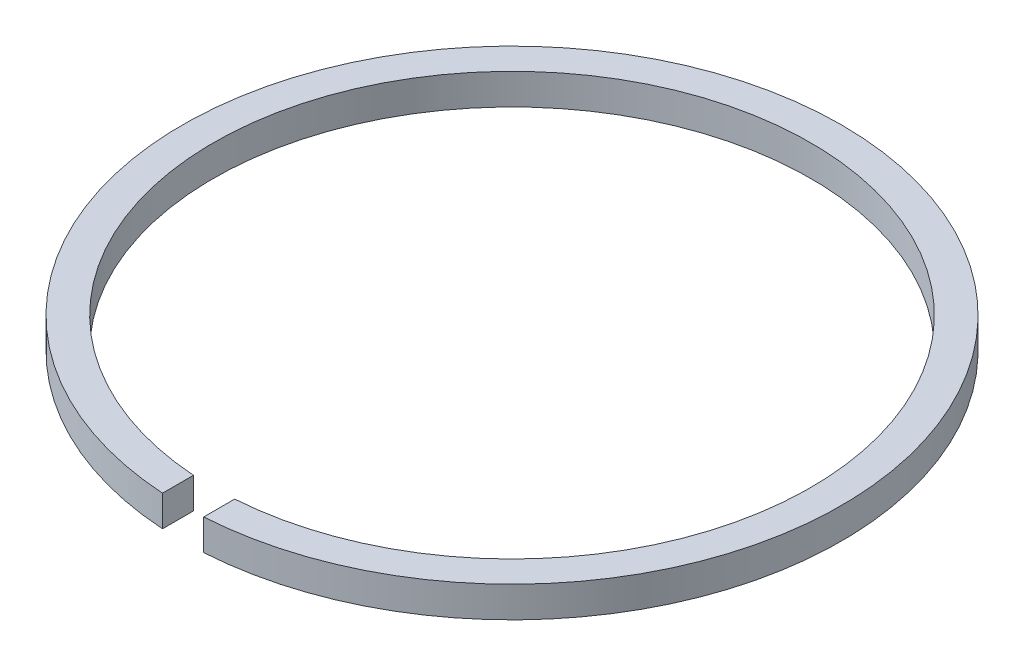
ISO-10303-21;
HEADER;
FILE_DESCRIPTION(('STEP AP214'),'2;1');
FILE_NAME('part.step','',(''),(''),'','','');
FILE_SCHEMA(('AUTOMOTIVE_DESIGN { 1 0 10303 214 1 1 1 1 }'));
ENDSEC;
DATA;
#1=APPLICATION_CONTEXT('core data for automotive mechanical design processes');
#2=APPLICATION_PROTOCOL_DEFINITION('international standard','automotive_design',2000,#1);
#3=PRODUCT_CONTEXT('',#1,'mechanical');
#4=PRODUCT('Part','Part','',(#3));
#5=PRODUCT_RELATED_PRODUCT_CATEGORY('part','',(#4));
#6=PRODUCT_DEFINITION_FORMATION('','',#4);
#7=PRODUCT_DEFINITION_CONTEXT('part definition',#1,'design');
#8=PRODUCT_DEFINITION('design','',#6,#7);
#9=PRODUCT_DEFINITION_SHAPE('','',#8);
#10=(LENGTH_UNIT() NAMED_UNIT(*) SI_UNIT(.MILLI.,.METRE.));
#11=(NAMED_UNIT(*) PLANE_ANGLE_UNIT() SI_UNIT($,.RADIAN.));
#12=(NAMED_UNIT(*) SI_UNIT($,.STERADIAN.) SOLID_ANGLE_UNIT());
#13=UNCERTAINTY_MEASURE_WITH_UNIT(LENGTH_MEASURE(1.E-05),#10,'distance_accuracy_value','');
#14=(GEOMETRIC_REPRESENTATION_CONTEXT(3) GLOBAL_UNCERTAINTY_ASSIGNED_CONTEXT((#13)) GLOBAL_UNIT_ASSIGNED_CONTEXT((#10,
#11,#12)) REPRESENTATION_CONTEXT('',''));
#15=CARTESIAN_POINT('',(0.,0.,0.));
#16=DIRECTION('',(0.,0.,1.));
#17=DIRECTION('',(1.,0.,0.));
#18=AXIS2_PLACEMENT_3D('',#15,#16,#17);
#19=CARTESIAN_POINT('',(1.,1.5,14.4654761414894));
#20=DIRECTION('',(1.,0.,0.));
#21=DIRECTION('',(0.,0.,-1.));
#22=AXIS2_PLACEMENT_3D('',#19,#20,#21);
#23=PLANE('',#22);
#24=DIRECTION('',(0.,0.,1.));
#25=VECTOR('',#24,1.);
#26=CARTESIAN_POINT('',(1.,0.,14.4654761414894));
#27=LINE('',#26,#25);
#28=CARTESIAN_POINT('',(1.,0.,14.4654761414894));
#29=VERTEX_POINT('',#28);
#30=CARTESIAN_POINT('',(1.,0.,15.9687194226713));
#31=VERTEX_POINT('',#30);
#32=EDGE_CURVE('E95',#29,#31,#27,.T.);
#33=ORIENTED_EDGE('',*,*,#32,.T.);
#34=DIRECTION('',(0.,-1.,0.));
#35=VECTOR('',#34,1.);
#36=CARTESIAN_POINT('',(1.,1.5,15.9687194226713));
#37=LINE('',#36,#35);
#38=CARTESIAN_POINT('',(1.,1.5,15.9687194226713));
#39=VERTEX_POINT('',#38);
#40=EDGE_CURVE('E11',#39,#31,#37,.T.);
#41=ORIENTED_EDGE('',*,*,#40,.F.);
#42=DIRECTION('',(0.,0.,1.));
#43=VECTOR('',#42,1.);
#44=CARTESIAN_POINT('',(1.,1.5,14.4654761414894));
#45=LINE('',#44,#43);
#46=CARTESIAN_POINT('',(1.,1.5,14.4654761414894));
#47=VERTEX_POINT('',#46);
#48=EDGE_CURVE('E81',#47,#39,#45,.T.);
#49=ORIENTED_EDGE('',*,*,#48,.F.);
#50=DIRECTION('',(0.,-1.,0.));
#51=VECTOR('',#50,1.);
#52=CARTESIAN_POINT('',(1.,1.5,14.4654761414894));
#53=LINE('',#52,#51);
#54=EDGE_CURVE('E48',#47,#29,#53,.T.);
#55=ORIENTED_EDGE('',*,*,#54,.T.);
#56=EDGE_LOOP('',(#33,#41,#49,#55));
#57=FACE_BOUND('',#56,.T.);
#58=ADVANCED_FACE('F32',(#57),#23,.F.);
#59=CARTESIAN_POINT('',(0.,1.5,0.));
#60=DIRECTION('',(0.,-1.,0.));
#61=DIRECTION('',(0.,0.,-1.));
#62=AXIS2_PLACEMENT_3D('',#59,#60,#61);
#63=CYLINDRICAL_SURFACE('',#62,16.);
#64=CARTESIAN_POINT('',(0.,0.,0.));
#65=DIRECTION('',(0.,1.,0.));
#66=DIRECTION('',(0.,0.,1.));
#67=AXIS2_PLACEMENT_3D('',#64,#65,#66);
#68=CIRCLE('',#67,16.);
#69=CARTESIAN_POINT('',(-0.999999999999999,0.,15.9687194226713));
#70=VERTEX_POINT('',#69);
#71=EDGE_CURVE('E86',#31,#70,#68,.T.);
#72=ORIENTED_EDGE('',*,*,#71,.T.);
#73=DIRECTION('',(0.,-1.,0.));
#74=VECTOR('',#73,1.);
#75=CARTESIAN_POINT('',(-0.999999999999999,1.5,15.9687194226713));
#76=LINE('',#75,#74);
#77=CARTESIAN_POINT('',(-0.999999999999999,1.5,15.9687194226713));
#78=VERTEX_POINT('',#77);
#79=EDGE_CURVE('E40',#78,#70,#76,.T.);
#80=ORIENTED_EDGE('',*,*,#79,.F.);
#81=CARTESIAN_POINT('',(0.,1.5,0.));
#82=DIRECTION('',(0.,1.,0.));
#83=DIRECTION('',(0.,0.,1.));
#84=AXIS2_PLACEMENT_3D('',#81,#82,#83);
#85=CIRCLE('',#84,16.);
#86=EDGE_CURVE('E73',#39,#78,#85,.T.);
#87=ORIENTED_EDGE('',*,*,#86,.F.);
#88=ORIENTED_EDGE('',*,*,#40,.T.);
#89=EDGE_LOOP('',(#72,#80,#87,#88));
#90=FACE_BOUND('',#89,.T.);
#91=ADVANCED_FACE('F85',(#90),#63,.T.);
#92=CARTESIAN_POINT('',(-1.,1.5,14.4654761414894));
#93=DIRECTION('',(1.,0.,0.));
#94=DIRECTION('',(0.,0.,-1.));
#95=AXIS2_PLACEMENT_3D('',#92,#93,#94);
#96=PLANE('',#95);
#97=DIRECTION('',(0.,0.,1.));
#98=VECTOR('',#97,1.);
#99=CARTESIAN_POINT('',(-1.,0.,14.4654761414894));
#100=LINE('',#99,#98);
#101=CARTESIAN_POINT('',(-1.,0.,14.4654761414894));
#102=VERTEX_POINT('',#101);
#103=EDGE_CURVE('E98',#102,#70,#100,.T.);
#104=ORIENTED_EDGE('',*,*,#103,.F.);
#105=DIRECTION('',(0.,-1.,0.));
#106=VECTOR('',#105,1.);
#107=CARTESIAN_POINT('',(-1.,1.5,14.4654761414894));
#108=LINE('',#107,#106);
#109=CARTESIAN_POINT('',(-1.,1.5,14.4654761414894));
#110=VERTEX_POINT('',#109);
#111=EDGE_CURVE('E62',#110,#102,#108,.T.);
#112=ORIENTED_EDGE('',*,*,#111,.F.);
#113=DIRECTION('',(0.,0.,1.));
#114=VECTOR('',#113,1.);
#115=CARTESIAN_POINT('',(-1.,1.5,14.4654761414894));
#116=LINE('',#115,#114);
#117=EDGE_CURVE('E80',#110,#78,#116,.T.);
#118=ORIENTED_EDGE('',*,*,#117,.T.);
#119=ORIENTED_EDGE('',*,*,#79,.T.);
#120=EDGE_LOOP('',(#104,#112,#118,#119));
#121=FACE_BOUND('',#120,.T.);
#122=ADVANCED_FACE('F89',(#121),#96,.T.);
#123=CARTESIAN_POINT('',(0.,1.5,0.));
#124=DIRECTION('',(0.,-1.,0.));
#125=DIRECTION('',(0.,0.,-1.));
#126=AXIS2_PLACEMENT_3D('',#123,#124,#125);
#127=CYLINDRICAL_SURFACE('',#126,14.5);
#128=CARTESIAN_POINT('',(0.,0.,0.));
#129=DIRECTION('',(0.,1.,0.));
#130=DIRECTION('',(0.,0.,1.));
#131=AXIS2_PLACEMENT_3D('',#128,#129,#130);
#132=CIRCLE('',#131,14.5);
#133=EDGE_CURVE('E100',#29,#102,#132,.T.);
#134=ORIENTED_EDGE('',*,*,#133,.F.);
#135=ORIENTED_EDGE('',*,*,#54,.F.);
#136=CARTESIAN_POINT('',(0.,1.5,0.));
#137=DIRECTION('',(0.,1.,0.));
#138=DIRECTION('',(0.,0.,1.));
#139=AXIS2_PLACEMENT_3D('',#136,#137,#138);
#140=CIRCLE('',#139,14.5);
#141=EDGE_CURVE('E90',#47,#110,#140,.T.);
#142=ORIENTED_EDGE('',*,*,#141,.T.);
#143=ORIENTED_EDGE('',*,*,#111,.T.);
#144=EDGE_LOOP('',(#134,#135,#142,#143));
#145=FACE_BOUND('',#144,.T.);
#146=ADVANCED_FACE('F106',(#145),#127,.F.);
#147=CARTESIAN_POINT('',(0.,1.5,0.));
#148=DIRECTION('',(0.,1.,0.));
#149=DIRECTION('',(0.,0.,1.));
#150=AXIS2_PLACEMENT_3D('',#147,#148,#149);
#151=PLANE('',#150);
#152=ORIENTED_EDGE('',*,*,#48,.T.);
#153=ORIENTED_EDGE('',*,*,#86,.T.);
#154=ORIENTED_EDGE('',*,*,#117,.F.);
#155=ORIENTED_EDGE('',*,*,#141,.F.);
#156=EDGE_LOOP('',(#152,#153,#154,#155));
#157=FACE_BOUND('',#156,.T.);
#158=ADVANCED_FACE('F77',(#157),#151,.T.);
#159=CARTESIAN_POINT('',(0.,0.,0.));
#160=DIRECTION('',(0.,1.,0.));
#161=DIRECTION('',(0.,0.,1.));
#162=AXIS2_PLACEMENT_3D('',#159,#160,#161);
#163=PLANE('',#162);
#164=ORIENTED_EDGE('',*,*,#32,.F.);
#165=ORIENTED_EDGE('',*,*,#133,.T.);
#166=ORIENTED_EDGE('',*,*,#103,.T.);
#167=ORIENTED_EDGE('',*,*,#71,.F.);
#168=EDGE_LOOP('',(#164,#165,#166,#167));
#169=FACE_BOUND('',#168,.T.);
#170=ADVANCED_FACE('F105',(#169),#163,.F.);
#171=CLOSED_SHELL('',(#58,#91,#122,#146,#158,#170));
#172=MANIFOLD_SOLID_BREP('B2',#171);
#173=ADVANCED_BREP_SHAPE_REPRESENTATION('',(#18,#172),#14);
#174=SHAPE_DEFINITION_REPRESENTATION(#9,#173);
ENDSEC;
END-ISO-10303-21;
